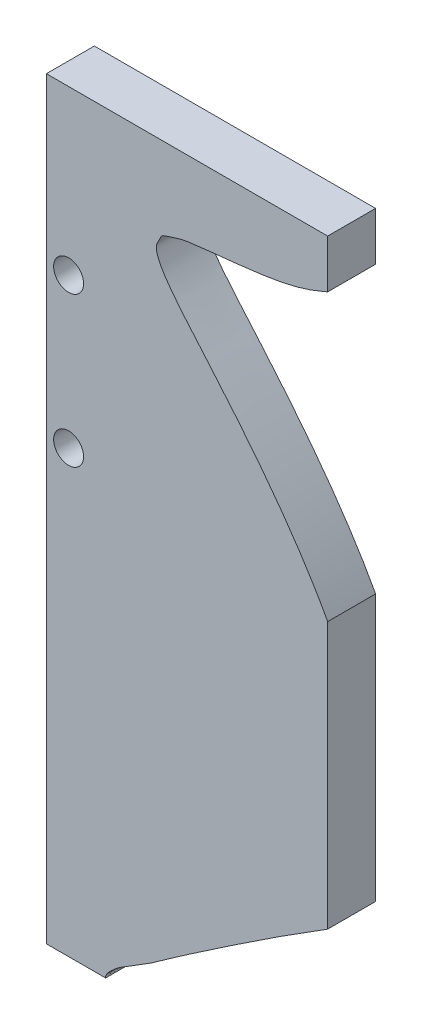
ISO-10303-21;
HEADER;
FILE_DESCRIPTION(('STEP AP214'),'2;1');
FILE_NAME('part.step','',(''),(''),'','','');
FILE_SCHEMA(('AUTOMOTIVE_DESIGN { 1 0 10303 214 1 1 1 1 }'));
ENDSEC;
DATA;
#1=APPLICATION_CONTEXT('core data for automotive mechanical design processes');
#2=APPLICATION_PROTOCOL_DEFINITION('international standard','automotive_design',2000,#1);
#3=PRODUCT_CONTEXT('',#1,'mechanical');
#4=PRODUCT('Part','Part','',(#3));
#5=PRODUCT_RELATED_PRODUCT_CATEGORY('part','',(#4));
#6=PRODUCT_DEFINITION_FORMATION('','',#4);
#7=PRODUCT_DEFINITION_CONTEXT('part definition',#1,'design');
#8=PRODUCT_DEFINITION('design','',#6,#7);
#9=PRODUCT_DEFINITION_SHAPE('','',#8);
#10=(LENGTH_UNIT() NAMED_UNIT(*) SI_UNIT(.MILLI.,.METRE.));
#11=(NAMED_UNIT(*) PLANE_ANGLE_UNIT() SI_UNIT($,.RADIAN.));
#12=(NAMED_UNIT(*) SI_UNIT($,.STERADIAN.) SOLID_ANGLE_UNIT());
#13=UNCERTAINTY_MEASURE_WITH_UNIT(LENGTH_MEASURE(1.E-05),#10,'distance_accuracy_value','');
#14=(GEOMETRIC_REPRESENTATION_CONTEXT(3) GLOBAL_UNCERTAINTY_ASSIGNED_CONTEXT((#13)) GLOBAL_UNIT_ASSIGNED_CONTEXT((#10,
#11,#12)) REPRESENTATION_CONTEXT('',''));
#15=CARTESIAN_POINT('',(0.,0.,0.));
#16=DIRECTION('',(0.,0.,1.));
#17=DIRECTION('',(1.,0.,0.));
#18=AXIS2_PLACEMENT_3D('',#15,#16,#17);
#19=CARTESIAN_POINT('',(-98.7597098849299,-123.501295729028,51.9999999999997));
#20=DIRECTION('',(0.,0.,-1.));
#21=DIRECTION('',(-1.,0.,0.));
#22=AXIS2_PLACEMENT_3D('',#19,#20,#21);
#23=PLANE('',#22);
#24=CARTESIAN_POINT('',(-100.,-50.,51.9999999999997));
#25=DIRECTION('',(0.,0.,-1.));
#26=DIRECTION('',(-1.,0.,0.));
#27=AXIS2_PLACEMENT_3D('',#24,#25,#26);
#28=CIRCLE('',#27,2.5);
#29=CARTESIAN_POINT('',(-102.5,-50.,51.9999999999997));
#30=VERTEX_POINT('',#29);
#31=EDGE_CURVE('E284',#30,#30,#28,.F.);
#32=ORIENTED_EDGE('',*,*,#31,.T.);
#33=EDGE_LOOP('',(#32));
#34=FACE_BOUND('',#33,.T.);
#35=CARTESIAN_POINT('',(-103.702711141899,-123.506773798911,51.9999999999997));
#36=CARTESIAN_POINT('',(-100.40737687753,-123.503208084161,51.9999999999997));
#37=CARTESIAN_POINT('',(-97.112042786673,-123.499476187349,51.9999999999997));
#38=CARTESIAN_POINT('',(-93.8167089449312,-123.495539218782,51.9999999999997));
#39=B_SPLINE_CURVE_WITH_KNOTS('',3,(#35,#36,#37,#38),.UNSPECIFIED.,.F.,.F.,(4,4),(0.,1.),.UNSPECIFIED.);
#40=CARTESIAN_POINT('',(-103.702711141899,-123.506773798911,51.9999999999997));
#41=VERTEX_POINT('',#40);
#42=CARTESIAN_POINT('',(-93.8167089449152,-123.495539218776,51.9999999999997));
#43=VERTEX_POINT('',#42);
#44=EDGE_CURVE('E272',#41,#43,#39,.T.);
#45=ORIENTED_EDGE('',*,*,#44,.F.);
#46=DIRECTION('',(2.22965543061431E-06,-0.999999999997514,0.));
#47=VECTOR('',#46,1.);
#48=CARTESIAN_POINT('',(-103.702991549551,2.25600000000001,51.9999999999997));
#49=LINE('',#48,#47);
#50=CARTESIAN_POINT('',(-103.702991549551,2.25600000000001,51.9999999999997));
#51=VERTEX_POINT('',#50);
#52=EDGE_CURVE('E115',#51,#41,#49,.T.);
#53=ORIENTED_EDGE('',*,*,#52,.F.);
#54=DIRECTION('',(-1.,0.,0.));
#55=VECTOR('',#54,1.);
#56=CARTESIAN_POINT('',(-56.7695236325579,2.25600000000002,51.9999999999997));
#57=LINE('',#56,#55);
#58=CARTESIAN_POINT('',(-56.7695236325579,2.25600000000002,51.9999999999997));
#59=VERTEX_POINT('',#58);
#60=EDGE_CURVE('E100',#59,#51,#57,.T.);
#61=ORIENTED_EDGE('',*,*,#60,.F.);
#62=DIRECTION('',(1.15147957942794E-06,0.999999999999337,0.));
#63=VECTOR('',#62,1.);
#64=CARTESIAN_POINT('',(-56.7695329293014,-5.81773721069318,51.9999999999997));
#65=LINE('',#64,#63);
#66=CARTESIAN_POINT('',(-56.7695329293014,-5.81773721069318,51.9999999999997));
#67=VERTEX_POINT('',#66);
#68=EDGE_CURVE('E113',#67,#59,#65,.T.);
#69=ORIENTED_EDGE('',*,*,#68,.F.);
#70=CARTESIAN_POINT('',(-56.7695329292906,-53.4654598959933,51.9999999999997));
#71=CARTESIAN_POINT('',(-58.3279176550688,-50.5652022090008,51.9999999999997));
#72=CARTESIAN_POINT('',(-60.0458163650792,-47.7755593209565,51.9999999999997));
#73=CARTESIAN_POINT('',(-63.6841224257361,-42.3367029415574,51.9999999999997));
#74=CARTESIAN_POINT('',(-65.6066400958873,-39.6889528489687,51.9999999999997));
#75=CARTESIAN_POINT('',(-69.59385911654,-34.4920497823535,51.9999999999997));
#76=CARTESIAN_POINT('',(-71.6612789031946,-31.9447819049219,51.9999999999997));
#77=CARTESIAN_POINT('',(-74.832218781466,-28.1722898948834,51.9999999999997));
#78=CARTESIAN_POINT('',(-75.9009650378508,-26.9237924939028,51.9999999999997));
#79=CARTESIAN_POINT('',(-78.0446799906788,-24.4323687938481,51.9999999999997));
#80=CARTESIAN_POINT('',(-79.1191986805002,-23.1888206374747,51.9999999999997));
#81=CARTESIAN_POINT('',(-80.7095480647281,-21.3060758861857,51.9999999999997));
#82=CARTESIAN_POINT('',(-81.2357519471803,-20.675313188786,51.9999999999997));
#83=CARTESIAN_POINT('',(-82.2666969838601,-19.3963375704427,51.9999999999997));
#84=CARTESIAN_POINT('',(-82.7720159458991,-18.7485944348576,51.9999999999997));
#85=CARTESIAN_POINT('',(-83.4946382290064,-17.748233484109,51.9999999999997));
#86=CARTESIAN_POINT('',(-83.7296249870898,-17.4099931481599,51.9999999999997));
#87=CARTESIAN_POINT('',(-84.1791355004317,-16.7168750772351,51.9999999999997));
#88=CARTESIAN_POINT('',(-84.3939779161146,-16.3606429659094,51.9999999999997));
#89=CARTESIAN_POINT('',(-84.7867311302017,-15.6307206780778,51.9999999999997));
#90=CARTESIAN_POINT('',(-84.967426152921,-15.2561058803352,51.9999999999997));
#91=CARTESIAN_POINT('',(-85.1824313439142,-14.6718481787901,51.9999999999997));
#92=CARTESIAN_POINT('',(-85.244415864692,-14.4743277477087,51.9999999999997));
#93=CARTESIAN_POINT('',(-85.3343984825506,-14.0695728213538,51.9999999999997));
#94=CARTESIAN_POINT('',(-85.3627801968095,-13.8612529253944,51.9999999999997));
#95=CARTESIAN_POINT('',(-85.35728705094,-13.5512409796281,51.9999999999997));
#96=CARTESIAN_POINT('',(-85.3467868153444,-13.4471122573843,51.9999999999997));
#97=CARTESIAN_POINT('',(-85.3048660143386,-13.2422802780594,51.9999999999997));
#98=CARTESIAN_POINT('',(-85.2744862286209,-13.1433287680236,51.9999999999997));
#99=CARTESIAN_POINT('',(-85.1609206691903,-12.8547226659315,51.9999999999997));
#100=CARTESIAN_POINT('',(-85.0545474148648,-12.6738347536151,51.9999999999997));
#101=CARTESIAN_POINT('',(-84.9008335415997,-12.4014077728929,51.9999999999997));
#102=CARTESIAN_POINT('',(-84.8514702210148,-12.3095500159792,51.9999999999997));
#103=CARTESIAN_POINT('',(-84.7619168644723,-12.1207025199345,51.9999999999997));
#104=CARTESIAN_POINT('',(-84.7203415074834,-12.0244877968622,51.9999999999997));
#105=CARTESIAN_POINT('',(-84.6351759235635,-11.8331855671003,51.9999999999997));
#106=CARTESIAN_POINT('',(-84.5913276664033,-11.7382424150885,51.9999999999997));
#107=CARTESIAN_POINT('',(-84.4944879794927,-11.6132082485187,51.9999999999997));
#108=CARTESIAN_POINT('',(-84.4565469902504,-11.5740494880328,51.9999999999997));
#109=CARTESIAN_POINT('',(-84.3696728070496,-11.5046442460547,51.9999999999997));
#110=CARTESIAN_POINT('',(-84.3239274088768,-11.4756748098542,51.9999999999997));
#111=CARTESIAN_POINT('',(-84.183097584497,-11.3976920678572,51.9999999999997));
#112=CARTESIAN_POINT('',(-84.0844654237031,-11.3574903377027,51.9999999999997));
#113=CARTESIAN_POINT('',(-83.8846339212681,-11.2834630331249,51.9999999999997));
#114=CARTESIAN_POINT('',(-83.7834629030526,-11.2495671112729,51.9999999999997));
#115=CARTESIAN_POINT('',(-83.4796043306875,-11.1487375146238,51.9999999999997));
#116=CARTESIAN_POINT('',(-83.276104119419,-11.0841640781263,51.9999999999997));
#117=CARTESIAN_POINT('',(-82.6689046056831,-10.8793703577853,51.9999999999997));
#118=CARTESIAN_POINT('',(-82.2650326458475,-10.7388650229722,51.9999999999997));
#119=CARTESIAN_POINT('',(-81.6525586150427,-10.5566778668308,51.9999999999997));
#120=CARTESIAN_POINT('',(-81.4474307404424,-10.5001056503762,51.9999999999997));
#121=CARTESIAN_POINT('',(-81.0341631036103,-10.3998701587435,51.9999999999997));
#122=CARTESIAN_POINT('',(-80.8260614593274,-10.3560435101518,51.9999999999997));
#123=CARTESIAN_POINT('',(-80.1986764905888,-10.2377645888818,51.9999999999997));
#124=CARTESIAN_POINT('',(-79.7763810701999,-10.1762221502602,51.9999999999997));
#125=CARTESIAN_POINT('',(-78.9289304674237,-10.0653942042904,51.9999999999997));
#126=CARTESIAN_POINT('',(-78.5038131779734,-10.0163576966844,51.9999999999997));
#127=CARTESIAN_POINT('',(-77.6536389897566,-9.92228714463002,51.9999999999997));
#128=CARTESIAN_POINT('',(-77.228400846825,-9.87664682598323,51.9999999999997));
#129=CARTESIAN_POINT('',(-75.9523833648475,-9.74252460931887,51.9999999999997));
#130=CARTESIAN_POINT('',(-75.1012329882266,-9.65746929611332,51.9999999999997));
#131=CARTESIAN_POINT('',(-73.3995605468317,-9.48155612037187,51.9999999999997));
#132=CARTESIAN_POINT('',(-72.5489717216659,-9.3913147995562,51.9999999999997));
#133=CARTESIAN_POINT('',(-69.9987844775912,-9.10600641015252,51.9999999999997));
#134=CARTESIAN_POINT('',(-68.3002255443565,-8.89841004305052,51.9999999999997));
#135=CARTESIAN_POINT('',(-64.9242226955031,-8.3690471351075,51.9999999999997));
#136=CARTESIAN_POINT('',(-63.2448751892393,-8.0439101595905,51.9999999999997));
#137=CARTESIAN_POINT('',(-60.7677656707657,-7.35307160278596,51.9999999999997));
#138=CARTESIAN_POINT('',(-59.9532827825983,-7.08913814652217,51.9999999999997));
#139=CARTESIAN_POINT('',(-58.7491763104807,-6.64039524209417,51.9999999999997));
#140=CARTESIAN_POINT('',(-58.3506113854006,-6.48195714311191,51.9999999999997));
#141=CARTESIAN_POINT('',(-57.5584304449573,-6.15377882682249,51.9999999999997));
#142=CARTESIAN_POINT('',(-57.1650211104286,-5.9832687590392,51.9999999999997));
#143=CARTESIAN_POINT('',(-56.7695329293014,-5.81773721069318,51.9999999999997));
#144=B_SPLINE_CURVE_WITH_KNOTS('',3,(#70,#71,#72,#73,#74,#75,#76,#77,#78,#79,#80,#81,#82,#83,
#84,#85,#86,#87,#88,#89,#90,#91,#92,#93,#94,#95,#96,#97,#98,#99,#100,#101,#102,#103,#104,#105,
#106,#107,#108,#109,#110,#111,#112,#113,#114,#115,#116,#117,#118,#119,#120,#121,#122,#123,#124,
#125,#126,#127,#128,#129,#130,#131,#132,#133,#134,#135,#136,#137,#138,#139,#140,#141,#142,#143),
.UNSPECIFIED.,.F.,.F.,(4,2,2,2,2,2,2,2,2,2,2,2,2,2,2,2,2,2,2,2,2,2,2,2,2,2,2,2,2,2,2,2,2,2,2,2,
4),(0.,0.125000000000002,0.250000000000005,0.375000000000007,0.437500000000008,
0.500000000000009,0.53125000000001,0.56250000000001,0.57812500000001,0.593750000000011,
0.609375000000011,0.617187500000011,0.625000000000011,0.628906250000011,0.632812500000011,
0.640625000000011,0.644531250000011,0.648437500000011,0.652343750000011,0.654296875000011,
0.656250000000011,0.660156250000011,0.664062500000011,0.67187500000001,0.687500000000008,
0.695312500000008,0.703125000000007,0.718750000000007,0.734375000000006,0.750000000000006,
0.781250000000005,0.812500000000005,0.875000000000003,0.937500000000002,0.968750000000001,
0.984375,1.),.UNSPECIFIED.);
#145=CARTESIAN_POINT('',(-56.7695329292906,-53.4654598959933,51.9999999999997));
#146=VERTEX_POINT('',#145);
#147=EDGE_CURVE('E118',#146,#67,#144,.T.);
#148=ORIENTED_EDGE('',*,*,#147,.F.);
#149=DIRECTION('',(0.,1.,0.));
#150=VECTOR('',#149,1.);
#151=CARTESIAN_POINT('',(-56.7695329292915,-97.9128350395995,51.9999999999997));
#152=LINE('',#151,#150);
#153=CARTESIAN_POINT('',(-56.7695329292914,-97.9128350395995,51.9999999999997));
#154=VERTEX_POINT('',#153);
#155=EDGE_CURVE('E120',#154,#146,#152,.T.);
#156=ORIENTED_EDGE('',*,*,#155,.F.);
#157=CARTESIAN_POINT('',(-93.8167089449152,-123.495539218776,51.9999999999997));
#158=CARTESIAN_POINT('',(-93.8332632211288,-123.438087057128,51.9999999999997));
#159=CARTESIAN_POINT('',(-93.8377855377238,-123.376921328402,51.9999999999997));
#160=CARTESIAN_POINT('',(-93.8264744043645,-123.257250053105,51.9999999999997));
#161=CARTESIAN_POINT('',(-93.8111824820266,-123.198717746609,51.9999999999997));
#162=CARTESIAN_POINT('',(-93.7494208552882,-123.030722987781,51.9999999999997));
#163=CARTESIAN_POINT('',(-93.6880201761431,-122.926477343674,51.9999999999997));
#164=CARTESIAN_POINT('',(-93.4917076185506,-122.631146194355,51.9999999999997));
#165=CARTESIAN_POINT('',(-93.3367062290319,-122.45240204143,51.9999999999997));
#166=CARTESIAN_POINT('',(-93.0169346069029,-122.102260012443,51.9999999999997));
#167=CARTESIAN_POINT('',(-92.8490183291129,-121.936248649227,51.9999999999997));
#168=CARTESIAN_POINT('',(-92.5043262248207,-121.616698720141,51.9999999999997));
#169=CARTESIAN_POINT('',(-92.3270343333934,-121.463248328617,51.9999999999997));
#170=CARTESIAN_POINT('',(-91.78016075561,-121.022075968886,51.9999999999997));
#171=CARTESIAN_POINT('',(-91.3967571797871,-120.752028968307,51.9999999999997));
#172=CARTESIAN_POINT('',(-90.6116915416809,-120.235283305875,51.9999999999997));
#173=CARTESIAN_POINT('',(-90.2099845582809,-119.988566214134,51.9999999999997));
#174=CARTESIAN_POINT('',(-89.4027489630587,-119.502696725017,51.9999999999997));
#175=CARTESIAN_POINT('',(-88.9969349738565,-119.263219717501,51.9999999999997));
#176=CARTESIAN_POINT('',(-88.1886080730294,-118.779068406266,51.9999999999997));
#177=CARTESIAN_POINT('',(-87.7862285450289,-118.534184100149,51.9999999999997));
#178=CARTESIAN_POINT('',(-86.9881197384622,-118.033945174712,51.9999999999997));
#179=CARTESIAN_POINT('',(-86.5924278775835,-117.778531644081,51.9999999999997));
#180=CARTESIAN_POINT('',(-85.8093757259242,-117.254587157789,51.9999999999997));
#181=CARTESIAN_POINT('',(-85.4217465728039,-116.986479505483,51.9999999999997));
#182=CARTESIAN_POINT('',(-84.2657837580843,-116.171254220926,51.9999999999997));
#183=CARTESIAN_POINT('',(-83.5040080518885,-115.614728123363,51.9999999999997));
#184=CARTESIAN_POINT('',(-81.9645899911725,-114.524680942651,51.9999999999997));
#185=CARTESIAN_POINT('',(-81.1890789259843,-113.987935924136,51.9999999999997));
#186=CARTESIAN_POINT('',(-78.8562693496024,-112.38665625597,51.9999999999997));
#187=CARTESIAN_POINT('',(-77.2923524735934,-111.331685118164,51.9999999999997));
#188=CARTESIAN_POINT('',(-74.1701981019018,-109.213607793966,51.9999999999997));
#189=CARTESIAN_POINT('',(-72.6089835905598,-108.154769729908,51.9999999999997));
#190=CARTESIAN_POINT('',(-69.4736178044836,-106.056246505514,51.9999999999997));
#191=CARTESIAN_POINT('',(-67.8995647929402,-105.016648161566,51.9999999999997));
#192=CARTESIAN_POINT('',(-63.1593861132054,-101.925188361279,51.9999999999997));
#193=CARTESIAN_POINT('',(-59.9778750567322,-99.8976159745702,51.9999999999997));
#194=CARTESIAN_POINT('',(-56.7695329292914,-97.9128350395995,51.9999999999997));
#195=B_SPLINE_CURVE_WITH_KNOTS('',3,(#157,#158,#159,#160,#161,#162,#163,#164,#165,#166,#167,
#168,#169,#170,#171,#172,#173,#174,#175,#176,#177,#178,#179,#180,#181,#182,#183,#184,#185,#186,
#187,#188,#189,#190,#191,#192,#193,#194),.UNSPECIFIED.,.F.,.F.,(4,2,2,2,2,2,2,2,2,2,2,2,2,2,2,2,
2,2,4),(0.,0.00390625000000042,0.00781250000000083,0.0156250000000008,0.0312500000000008,
0.0468750000000007,0.0625000000000007,0.0937500000000006,0.125,0.15625,0.1875,0.21875,0.25,
0.312500000000001,0.375000000000001,0.500000000000001,0.625000000000001,0.750000000000001,1.),.UNSPECIFIED.);
#196=EDGE_CURVE('E235',#43,#154,#195,.T.);
#197=ORIENTED_EDGE('',*,*,#196,.F.);
#198=EDGE_LOOP('',(#45,#53,#61,#69,#148,#156,#197));
#199=FACE_BOUND('',#198,.T.);
#200=CARTESIAN_POINT('',(-100.,-25.,51.9999999999997));
#201=DIRECTION('',(0.,0.,-1.));
#202=DIRECTION('',(-1.,0.,0.));
#203=AXIS2_PLACEMENT_3D('',#200,#201,#202);
#204=CIRCLE('',#203,2.5);
#205=CARTESIAN_POINT('',(-102.5,-25.,51.9999999999997));
#206=VERTEX_POINT('',#205);
#207=EDGE_CURVE('E285',#206,#206,#204,.F.);
#208=ORIENTED_EDGE('',*,*,#207,.T.);
#209=EDGE_LOOP('',(#208));
#210=FACE_BOUND('',#209,.T.);
#211=ADVANCED_FACE('F30',(#34,#199,#210),#23,.T.);
#212=CARTESIAN_POINT('',(-98.7597098849299,-123.501295729028,59.9999999999997));
#213=DIRECTION('',(0.,0.,-1.));
#214=DIRECTION('',(-1.,0.,0.));
#215=AXIS2_PLACEMENT_3D('',#212,#213,#214);
#216=PLANE('',#215);
#217=CARTESIAN_POINT('',(-100.,-50.,59.9999999999997));
#218=DIRECTION('',(0.,0.,-1.));
#219=DIRECTION('',(-1.,0.,0.));
#220=AXIS2_PLACEMENT_3D('',#217,#218,#219);
#221=CIRCLE('',#220,2.5);
#222=CARTESIAN_POINT('',(-102.5,-50.,59.9999999999997));
#223=VERTEX_POINT('',#222);
#224=EDGE_CURVE('E282',#223,#223,#221,.F.);
#225=ORIENTED_EDGE('',*,*,#224,.F.);
#226=EDGE_LOOP('',(#225));
#227=FACE_BOUND('',#226,.T.);
#228=CARTESIAN_POINT('',(-93.8167089449312,-123.495539218782,59.9999999999997));
#229=CARTESIAN_POINT('',(-97.112042786673,-123.499476187349,59.9999999999997));
#230=CARTESIAN_POINT('',(-100.40737687753,-123.503208084161,59.9999999999997));
#231=CARTESIAN_POINT('',(-103.702711141899,-123.506773798911,59.9999999999997));
#232=B_SPLINE_CURVE_WITH_KNOTS('',3,(#228,#229,#230,#231),.UNSPECIFIED.,.F.,.F.,(4,4),(0.,1.),.UNSPECIFIED.);
#233=CARTESIAN_POINT('',(-103.702711141899,-123.506773798911,59.9999999999997));
#234=VERTEX_POINT('',#233);
#235=CARTESIAN_POINT('',(-93.8167089449152,-123.495539218776,59.9999999999997));
#236=VERTEX_POINT('',#235);
#237=EDGE_CURVE('E289',#234,#236,#232,.F.);
#238=ORIENTED_EDGE('',*,*,#237,.T.);
#239=CARTESIAN_POINT('',(-56.7695329292914,-97.9128350395995,59.9999999999997));
#240=CARTESIAN_POINT('',(-59.9778750567322,-99.8976159745702,59.9999999999997));
#241=CARTESIAN_POINT('',(-63.1593861132054,-101.925188361279,59.9999999999997));
#242=CARTESIAN_POINT('',(-67.8995647929402,-105.016648161566,59.9999999999997));
#243=CARTESIAN_POINT('',(-69.4736178044836,-106.056246505514,59.9999999999997));
#244=CARTESIAN_POINT('',(-72.6089835905598,-108.154769729908,59.9999999999997));
#245=CARTESIAN_POINT('',(-74.1701981019018,-109.213607793966,59.9999999999997));
#246=CARTESIAN_POINT('',(-77.2923524735934,-111.331685118164,59.9999999999997));
#247=CARTESIAN_POINT('',(-78.8562693496024,-112.38665625597,59.9999999999997));
#248=CARTESIAN_POINT('',(-81.1890789259843,-113.987935924136,59.9999999999997));
#249=CARTESIAN_POINT('',(-81.9645899911725,-114.524680942651,59.9999999999997));
#250=CARTESIAN_POINT('',(-83.5040080518885,-115.614728123363,59.9999999999997));
#251=CARTESIAN_POINT('',(-84.2657837580843,-116.171254220926,59.9999999999997));
#252=CARTESIAN_POINT('',(-85.4217465728039,-116.986479505483,59.9999999999997));
#253=CARTESIAN_POINT('',(-85.8093757259242,-117.254587157789,59.9999999999997));
#254=CARTESIAN_POINT('',(-86.5924278775835,-117.778531644081,59.9999999999997));
#255=CARTESIAN_POINT('',(-86.9881197384622,-118.033945174712,59.9999999999997));
#256=CARTESIAN_POINT('',(-87.7862285450289,-118.534184100149,59.9999999999997));
#257=CARTESIAN_POINT('',(-88.1886080730294,-118.779068406266,59.9999999999997));
#258=CARTESIAN_POINT('',(-88.9969349738565,-119.263219717501,59.9999999999997));
#259=CARTESIAN_POINT('',(-89.4027489630587,-119.502696725017,59.9999999999997));
#260=CARTESIAN_POINT('',(-90.2099845582809,-119.988566214134,59.9999999999997));
#261=CARTESIAN_POINT('',(-90.6116915416809,-120.235283305875,59.9999999999997));
#262=CARTESIAN_POINT('',(-91.3967571797871,-120.752028968307,59.9999999999997));
#263=CARTESIAN_POINT('',(-91.78016075561,-121.022075968886,59.9999999999997));
#264=CARTESIAN_POINT('',(-92.3270343333934,-121.463248328617,59.9999999999997));
#265=CARTESIAN_POINT('',(-92.5043262248207,-121.616698720141,59.9999999999997));
#266=CARTESIAN_POINT('',(-92.8490183291129,-121.936248649227,59.9999999999997));
#267=CARTESIAN_POINT('',(-93.0169346069029,-122.102260012443,59.9999999999997));
#268=CARTESIAN_POINT('',(-93.3367062290319,-122.45240204143,59.9999999999997));
#269=CARTESIAN_POINT('',(-93.4917076185506,-122.631146194355,59.9999999999997));
#270=CARTESIAN_POINT('',(-93.6880201761431,-122.926477343674,59.9999999999997));
#271=CARTESIAN_POINT('',(-93.7494208552882,-123.030722987781,59.9999999999997));
#272=CARTESIAN_POINT('',(-93.8111824820266,-123.198717746609,59.9999999999997));
#273=CARTESIAN_POINT('',(-93.8264744043645,-123.257250053105,59.9999999999997));
#274=CARTESIAN_POINT('',(-93.8377855377238,-123.376921328402,59.9999999999997));
#275=CARTESIAN_POINT('',(-93.8332632211288,-123.438087057128,59.9999999999997));
#276=CARTESIAN_POINT('',(-93.8167089449152,-123.495539218776,59.9999999999997));
#277=B_SPLINE_CURVE_WITH_KNOTS('',3,(#239,#240,#241,#242,#243,#244,#245,#246,#247,#248,#249,
#250,#251,#252,#253,#254,#255,#256,#257,#258,#259,#260,#261,#262,#263,#264,#265,#266,#267,#268,
#269,#270,#271,#272,#273,#274,#275,#276),.UNSPECIFIED.,.F.,.F.,(4,2,2,2,2,2,2,2,2,2,2,2,2,2,2,2,
2,2,4),(0.,0.249999999999999,0.374999999999999,0.499999999999999,0.624999999999999,
0.687499999999999,0.75,0.78125,0.8125,0.84375,0.875,0.906249999999999,0.937499999999999,
0.953124999999999,0.968749999999999,0.984374999999999,0.992187499999999,0.99609375,1.),.UNSPECIFIED.);
#278=CARTESIAN_POINT('',(-56.7695329292914,-97.9128350395995,59.9999999999997));
#279=VERTEX_POINT('',#278);
#280=EDGE_CURVE('E169',#236,#279,#277,.F.);
#281=ORIENTED_EDGE('',*,*,#280,.T.);
#282=DIRECTION('',(0.,1.,0.));
#283=VECTOR('',#282,1.);
#284=CARTESIAN_POINT('',(-56.7695329292915,-97.9128350395995,59.9999999999997));
#285=LINE('',#284,#283);
#286=CARTESIAN_POINT('',(-56.7695329292906,-53.4654598959933,59.9999999999997));
#287=VERTEX_POINT('',#286);
#288=EDGE_CURVE('E222',#279,#287,#285,.T.);
#289=ORIENTED_EDGE('',*,*,#288,.T.);
#290=CARTESIAN_POINT('',(-56.7695329293014,-5.81773721069318,59.9999999999997));
#291=CARTESIAN_POINT('',(-57.1650211104286,-5.9832687590392,59.9999999999997));
#292=CARTESIAN_POINT('',(-57.5584304449573,-6.15377882682249,59.9999999999997));
#293=CARTESIAN_POINT('',(-58.3506113854006,-6.48195714311191,59.9999999999997));
#294=CARTESIAN_POINT('',(-58.7491763104807,-6.64039524209417,59.9999999999997));
#295=CARTESIAN_POINT('',(-59.9532827825983,-7.08913814652217,59.9999999999997));
#296=CARTESIAN_POINT('',(-60.7677656707657,-7.35307160278596,59.9999999999997));
#297=CARTESIAN_POINT('',(-63.2448751892393,-8.0439101595905,59.9999999999997));
#298=CARTESIAN_POINT('',(-64.9242226955031,-8.3690471351075,59.9999999999997));
#299=CARTESIAN_POINT('',(-68.3002255443565,-8.89841004305052,59.9999999999997));
#300=CARTESIAN_POINT('',(-69.9987844775912,-9.10600641015252,59.9999999999997));
#301=CARTESIAN_POINT('',(-72.5489717216659,-9.3913147995562,59.9999999999997));
#302=CARTESIAN_POINT('',(-73.3995605468317,-9.48155612037187,59.9999999999997));
#303=CARTESIAN_POINT('',(-75.1012329882266,-9.65746929611332,59.9999999999997));
#304=CARTESIAN_POINT('',(-75.9523833648475,-9.74252460931887,59.9999999999997));
#305=CARTESIAN_POINT('',(-77.228400846825,-9.87664682598323,59.9999999999997));
#306=CARTESIAN_POINT('',(-77.6536389897566,-9.92228714463002,59.9999999999997));
#307=CARTESIAN_POINT('',(-78.5038131779734,-10.0163576966844,59.9999999999997));
#308=CARTESIAN_POINT('',(-78.9289304674237,-10.0653942042904,59.9999999999997));
#309=CARTESIAN_POINT('',(-79.7763810701999,-10.1762221502602,59.9999999999997));
#310=CARTESIAN_POINT('',(-80.1986764905888,-10.2377645888818,59.9999999999997));
#311=CARTESIAN_POINT('',(-80.8260614593274,-10.3560435101518,59.9999999999997));
#312=CARTESIAN_POINT('',(-81.0341631036103,-10.3998701587435,59.9999999999997));
#313=CARTESIAN_POINT('',(-81.4474307404424,-10.5001056503762,59.9999999999997));
#314=CARTESIAN_POINT('',(-81.6525586150427,-10.5566778668308,59.9999999999997));
#315=CARTESIAN_POINT('',(-82.2650326458475,-10.7388650229722,59.9999999999997));
#316=CARTESIAN_POINT('',(-82.6689046056831,-10.8793703577853,59.9999999999997));
#317=CARTESIAN_POINT('',(-83.276104119419,-11.0841640781263,59.9999999999997));
#318=CARTESIAN_POINT('',(-83.4796043306875,-11.1487375146238,59.9999999999997));
#319=CARTESIAN_POINT('',(-83.7834629030526,-11.2495671112729,59.9999999999997));
#320=CARTESIAN_POINT('',(-83.8846339212681,-11.2834630331249,59.9999999999997));
#321=CARTESIAN_POINT('',(-84.0844654237031,-11.3574903377027,59.9999999999997));
#322=CARTESIAN_POINT('',(-84.183097584497,-11.3976920678572,59.9999999999997));
#323=CARTESIAN_POINT('',(-84.3239274088768,-11.4756748098542,59.9999999999997));
#324=CARTESIAN_POINT('',(-84.3696728070496,-11.5046442460547,59.9999999999997));
#325=CARTESIAN_POINT('',(-84.4565469902504,-11.5740494880328,59.9999999999997));
#326=CARTESIAN_POINT('',(-84.4944879794927,-11.6132082485187,59.9999999999997));
#327=CARTESIAN_POINT('',(-84.5913276664033,-11.7382424150885,59.9999999999997));
#328=CARTESIAN_POINT('',(-84.6351759235635,-11.8331855671003,59.9999999999997));
#329=CARTESIAN_POINT('',(-84.7203415074834,-12.0244877968622,59.9999999999997));
#330=CARTESIAN_POINT('',(-84.7619168644723,-12.1207025199345,59.9999999999997));
#331=CARTESIAN_POINT('',(-84.8514702210148,-12.3095500159792,59.9999999999997));
#332=CARTESIAN_POINT('',(-84.9008335415997,-12.4014077728929,59.9999999999997));
#333=CARTESIAN_POINT('',(-85.0545474148648,-12.6738347536151,59.9999999999997));
#334=CARTESIAN_POINT('',(-85.1609206691903,-12.8547226659315,59.9999999999997));
#335=CARTESIAN_POINT('',(-85.2744862286209,-13.1433287680236,59.9999999999997));
#336=CARTESIAN_POINT('',(-85.3048660143386,-13.2422802780594,59.9999999999997));
#337=CARTESIAN_POINT('',(-85.3467868153444,-13.4471122573843,59.9999999999997));
#338=CARTESIAN_POINT('',(-85.35728705094,-13.5512409796281,59.9999999999997));
#339=CARTESIAN_POINT('',(-85.3627801968095,-13.8612529253944,59.9999999999997));
#340=CARTESIAN_POINT('',(-85.3343984825506,-14.0695728213538,59.9999999999997));
#341=CARTESIAN_POINT('',(-85.244415864692,-14.4743277477087,59.9999999999997));
#342=CARTESIAN_POINT('',(-85.1824313439142,-14.6718481787901,59.9999999999997));
#343=CARTESIAN_POINT('',(-84.967426152921,-15.2561058803352,59.9999999999997));
#344=CARTESIAN_POINT('',(-84.7867311302017,-15.6307206780778,59.9999999999997));
#345=CARTESIAN_POINT('',(-84.3939779161146,-16.3606429659094,59.9999999999997));
#346=CARTESIAN_POINT('',(-84.1791355004317,-16.7168750772351,59.9999999999997));
#347=CARTESIAN_POINT('',(-83.7296249870898,-17.4099931481599,59.9999999999997));
#348=CARTESIAN_POINT('',(-83.4946382290064,-17.748233484109,59.9999999999997));
#349=CARTESIAN_POINT('',(-82.7720159458991,-18.7485944348576,59.9999999999997));
#350=CARTESIAN_POINT('',(-82.2666969838601,-19.3963375704427,59.9999999999997));
#351=CARTESIAN_POINT('',(-81.2357519471803,-20.675313188786,59.9999999999997));
#352=CARTESIAN_POINT('',(-80.7095480647281,-21.3060758861857,59.9999999999997));
#353=CARTESIAN_POINT('',(-79.1191986805002,-23.1888206374747,59.9999999999997));
#354=CARTESIAN_POINT('',(-78.0446799906788,-24.4323687938481,59.9999999999997));
#355=CARTESIAN_POINT('',(-75.9009650378508,-26.9237924939028,59.9999999999997));
#356=CARTESIAN_POINT('',(-74.832218781466,-28.1722898948834,59.9999999999997));
#357=CARTESIAN_POINT('',(-71.6612789031946,-31.9447819049219,59.9999999999997));
#358=CARTESIAN_POINT('',(-69.59385911654,-34.4920497823535,59.9999999999997));
#359=CARTESIAN_POINT('',(-65.6066400958873,-39.6889528489687,59.9999999999997));
#360=CARTESIAN_POINT('',(-63.6841224257361,-42.3367029415574,59.9999999999997));
#361=CARTESIAN_POINT('',(-60.0458163650792,-47.7755593209565,59.9999999999997));
#362=CARTESIAN_POINT('',(-58.3279176550688,-50.5652022090008,59.9999999999997));
#363=CARTESIAN_POINT('',(-56.7695329292906,-53.4654598959933,59.9999999999997));
#364=B_SPLINE_CURVE_WITH_KNOTS('',3,(#290,#291,#292,#293,#294,#295,#296,#297,#298,#299,#300,
#301,#302,#303,#304,#305,#306,#307,#308,#309,#310,#311,#312,#313,#314,#315,#316,#317,#318,#319,
#320,#321,#322,#323,#324,#325,#326,#327,#328,#329,#330,#331,#332,#333,#334,#335,#336,#337,#338,
#339,#340,#341,#342,#343,#344,#345,#346,#347,#348,#349,#350,#351,#352,#353,#354,#355,#356,#357,
#358,#359,#360,#361,#362,#363),.UNSPECIFIED.,.F.,.F.,(4,2,2,2,2,2,2,2,2,2,2,2,2,2,2,2,2,2,2,2,2,
2,2,2,2,2,2,2,2,2,2,2,2,2,2,2,4),(0.,0.0156249999999997,0.0312499999999992,0.0624999999999983,
0.124999999999997,0.187499999999995,0.218749999999995,0.249999999999994,0.265624999999994,
0.281249999999993,0.296874999999993,0.304687499999992,0.312499999999992,0.32812499999999,
0.335937499999989,0.339843749999989,0.343749999999989,0.345703124999989,0.347656249999989,
0.351562499999989,0.355468749999989,0.359374999999989,0.367187499999989,0.371093749999989,
0.374999999999989,0.382812499999989,0.390624999999989,0.406249999999989,0.42187499999999,
0.43749999999999,0.46874999999999,0.499999999999991,0.562499999999992,0.624999999999993,
0.749999999999995,0.874999999999998,1.),.UNSPECIFIED.);
#365=CARTESIAN_POINT('',(-56.7695329293014,-5.81773721069318,59.9999999999997));
#366=VERTEX_POINT('',#365);
#367=EDGE_CURVE('E132',#287,#366,#364,.F.);
#368=ORIENTED_EDGE('',*,*,#367,.T.);
#369=DIRECTION('',(1.15147957942794E-06,0.999999999999337,0.));
#370=VECTOR('',#369,1.);
#371=CARTESIAN_POINT('',(-56.7695329293014,-5.81773721069318,59.9999999999997));
#372=LINE('',#371,#370);
#373=CARTESIAN_POINT('',(-56.7695236325579,2.25600000000002,59.9999999999997));
#374=VERTEX_POINT('',#373);
#375=EDGE_CURVE('E231',#366,#374,#372,.T.);
#376=ORIENTED_EDGE('',*,*,#375,.T.);
#377=DIRECTION('',(-1.,0.,0.));
#378=VECTOR('',#377,1.);
#379=CARTESIAN_POINT('',(-56.7695236325579,2.25600000000002,59.9999999999997));
#380=LINE('',#379,#378);
#381=CARTESIAN_POINT('',(-103.702991549551,2.25600000000001,59.9999999999997));
#382=VERTEX_POINT('',#381);
#383=EDGE_CURVE('E102',#374,#382,#380,.T.);
#384=ORIENTED_EDGE('',*,*,#383,.T.);
#385=DIRECTION('',(2.22965543061431E-06,-0.999999999997514,0.));
#386=VECTOR('',#385,1.);
#387=CARTESIAN_POINT('',(-103.702991549551,2.25600000000001,59.9999999999997));
#388=LINE('',#387,#386);
#389=EDGE_CURVE('E273',#382,#234,#388,.T.);
#390=ORIENTED_EDGE('',*,*,#389,.T.);
#391=EDGE_LOOP('',(#238,#281,#289,#368,#376,#384,#390));
#392=FACE_BOUND('',#391,.T.);
#393=CARTESIAN_POINT('',(-100.,-25.,59.9999999999997));
#394=DIRECTION('',(0.,0.,-1.));
#395=DIRECTION('',(-1.,0.,0.));
#396=AXIS2_PLACEMENT_3D('',#393,#394,#395);
#397=CIRCLE('',#396,2.5);
#398=CARTESIAN_POINT('',(-102.5,-25.,59.9999999999997));
#399=VERTEX_POINT('',#398);
#400=EDGE_CURVE('E36',#399,#399,#397,.F.);
#401=ORIENTED_EDGE('',*,*,#400,.F.);
#402=EDGE_LOOP('',(#401));
#403=FACE_BOUND('',#402,.T.);
#404=ADVANCED_FACE('F138',(#227,#392,#403),#216,.F.);
#405=CARTESIAN_POINT('',(-103.702711141899,-123.506773798911,51.9999999999997));
#406=CARTESIAN_POINT('',(-100.40737687753,-123.503208084161,51.9999999999997));
#407=CARTESIAN_POINT('',(-97.112042786673,-123.499476187349,51.9999999999997));
#408=CARTESIAN_POINT('',(-93.8167089449312,-123.495539218782,51.9999999999997));
#409=B_SPLINE_CURVE_WITH_KNOTS('',3,(#405,#406,#407,#408),.UNSPECIFIED.,.F.,.F.,(4,4),(0.,1.),.UNSPECIFIED.);
#410=DIRECTION('',(0.,0.,1.));
#411=VECTOR('',#410,1.);
#412=SURFACE_OF_LINEAR_EXTRUSION('',#409,#411);
#413=ORIENTED_EDGE('',*,*,#237,.F.);
#414=DIRECTION('',(0.,0.,1.));
#415=VECTOR('',#414,1.);
#416=CARTESIAN_POINT('',(-103.702711141899,-123.506773798911,51.9999999999997));
#417=LINE('',#416,#415);
#418=EDGE_CURVE('E11',#41,#234,#417,.T.);
#419=ORIENTED_EDGE('',*,*,#418,.F.);
#420=ORIENTED_EDGE('',*,*,#44,.T.);
#421=DIRECTION('',(0.,0.,1.));
#422=VECTOR('',#421,1.);
#423=CARTESIAN_POINT('',(-93.8167089449152,-123.495539218776,51.9999999999997));
#424=LINE('',#423,#422);
#425=EDGE_CURVE('E86',#43,#236,#424,.T.);
#426=ORIENTED_EDGE('',*,*,#425,.T.);
#427=EDGE_LOOP('',(#413,#419,#420,#426));
#428=FACE_BOUND('',#427,.T.);
#429=ADVANCED_FACE('F32',(#428),#412,.T.);
#430=CARTESIAN_POINT('',(-103.702991549551,2.25600000000001,51.9999999999997));
#431=DIRECTION('',(-0.999999999997514,-2.22965543061431E-06,0.));
#432=DIRECTION('',(2.22965543061431E-06,-0.999999999997514,0.));
#433=AXIS2_PLACEMENT_3D('',#430,#431,#432);
#434=PLANE('',#433);
#435=ORIENTED_EDGE('',*,*,#389,.F.);
#436=DIRECTION('',(0.,0.,1.));
#437=VECTOR('',#436,1.);
#438=CARTESIAN_POINT('',(-103.702991549551,2.25600000000001,51.9999999999997));
#439=LINE('',#438,#437);
#440=EDGE_CURVE('E42',#51,#382,#439,.T.);
#441=ORIENTED_EDGE('',*,*,#440,.F.);
#442=ORIENTED_EDGE('',*,*,#52,.T.);
#443=ORIENTED_EDGE('',*,*,#418,.T.);
#444=EDGE_LOOP('',(#435,#441,#442,#443));
#445=FACE_BOUND('',#444,.T.);
#446=ADVANCED_FACE('F151',(#445),#434,.T.);
#447=CARTESIAN_POINT('',(-56.7695236325579,2.25600000000002,51.9999999999997));
#448=DIRECTION('',(0.,1.,0.));
#449=DIRECTION('',(-1.,0.,0.));
#450=AXIS2_PLACEMENT_3D('',#447,#448,#449);
#451=PLANE('',#450);
#452=ORIENTED_EDGE('',*,*,#383,.F.);
#453=DIRECTION('',(0.,0.,1.));
#454=VECTOR('',#453,1.);
#455=CARTESIAN_POINT('',(-56.7695236325579,2.25600000000002,51.9999999999997));
#456=LINE('',#455,#454);
#457=EDGE_CURVE('E97',#59,#374,#456,.T.);
#458=ORIENTED_EDGE('',*,*,#457,.F.);
#459=ORIENTED_EDGE('',*,*,#60,.T.);
#460=ORIENTED_EDGE('',*,*,#440,.T.);
#461=EDGE_LOOP('',(#452,#458,#459,#460));
#462=FACE_BOUND('',#461,.T.);
#463=ADVANCED_FACE('F99',(#462),#451,.T.);
#464=CARTESIAN_POINT('',(-56.7695329293014,-5.81773721069318,51.9999999999997));
#465=DIRECTION('',(0.999999999999337,-1.15147957942794E-06,0.));
#466=DIRECTION('',(1.15147957942794E-06,0.999999999999337,0.));
#467=AXIS2_PLACEMENT_3D('',#464,#465,#466);
#468=PLANE('',#467);
#469=ORIENTED_EDGE('',*,*,#375,.F.);
#470=DIRECTION('',(0.,0.,1.));
#471=VECTOR('',#470,1.);
#472=CARTESIAN_POINT('',(-56.7695329293014,-5.81773721069318,51.9999999999997));
#473=LINE('',#472,#471);
#474=EDGE_CURVE('E107',#67,#366,#473,.T.);
#475=ORIENTED_EDGE('',*,*,#474,.F.);
#476=ORIENTED_EDGE('',*,*,#68,.T.);
#477=ORIENTED_EDGE('',*,*,#457,.T.);
#478=EDGE_LOOP('',(#469,#475,#476,#477));
#479=FACE_BOUND('',#478,.T.);
#480=ADVANCED_FACE('F117',(#479),#468,.T.);
#481=CARTESIAN_POINT('',(-56.7695329292906,-53.4654598959933,51.9999999999997));
#482=CARTESIAN_POINT('',(-58.3279176550688,-50.5652022090008,51.9999999999997));
#483=CARTESIAN_POINT('',(-60.0458163650792,-47.7755593209565,51.9999999999997));
#484=CARTESIAN_POINT('',(-63.6841224257361,-42.3367029415574,51.9999999999997));
#485=CARTESIAN_POINT('',(-65.6066400958873,-39.6889528489687,51.9999999999997));
#486=CARTESIAN_POINT('',(-69.59385911654,-34.4920497823535,51.9999999999997));
#487=CARTESIAN_POINT('',(-71.6612789031946,-31.9447819049219,51.9999999999997));
#488=CARTESIAN_POINT('',(-74.832218781466,-28.1722898948834,51.9999999999997));
#489=CARTESIAN_POINT('',(-75.9009650378508,-26.9237924939028,51.9999999999997));
#490=CARTESIAN_POINT('',(-78.0446799906788,-24.4323687938481,51.9999999999997));
#491=CARTESIAN_POINT('',(-79.1191986805002,-23.1888206374747,51.9999999999997));
#492=CARTESIAN_POINT('',(-80.7095480647281,-21.3060758861857,51.9999999999997));
#493=CARTESIAN_POINT('',(-81.2357519471803,-20.675313188786,51.9999999999997));
#494=CARTESIAN_POINT('',(-82.2666969838601,-19.3963375704427,51.9999999999997));
#495=CARTESIAN_POINT('',(-82.7720159458991,-18.7485944348576,51.9999999999997));
#496=CARTESIAN_POINT('',(-83.4946382290064,-17.748233484109,51.9999999999997));
#497=CARTESIAN_POINT('',(-83.7296249870898,-17.4099931481599,51.9999999999997));
#498=CARTESIAN_POINT('',(-84.1791355004317,-16.7168750772351,51.9999999999997));
#499=CARTESIAN_POINT('',(-84.3939779161146,-16.3606429659094,51.9999999999997));
#500=CARTESIAN_POINT('',(-84.7867311302017,-15.6307206780778,51.9999999999997));
#501=CARTESIAN_POINT('',(-84.967426152921,-15.2561058803352,51.9999999999997));
#502=CARTESIAN_POINT('',(-85.1824313439142,-14.6718481787901,51.9999999999997));
#503=CARTESIAN_POINT('',(-85.244415864692,-14.4743277477087,51.9999999999997));
#504=CARTESIAN_POINT('',(-85.3343984825506,-14.0695728213538,51.9999999999997));
#505=CARTESIAN_POINT('',(-85.3627801968095,-13.8612529253944,51.9999999999997));
#506=CARTESIAN_POINT('',(-85.35728705094,-13.5512409796281,51.9999999999997));
#507=CARTESIAN_POINT('',(-85.3467868153444,-13.4471122573843,51.9999999999997));
#508=CARTESIAN_POINT('',(-85.3048660143386,-13.2422802780594,51.9999999999997));
#509=CARTESIAN_POINT('',(-85.2744862286209,-13.1433287680236,51.9999999999997));
#510=CARTESIAN_POINT('',(-85.1609206691903,-12.8547226659315,51.9999999999997));
#511=CARTESIAN_POINT('',(-85.0545474148648,-12.6738347536151,51.9999999999997));
#512=CARTESIAN_POINT('',(-84.9008335415997,-12.4014077728929,51.9999999999997));
#513=CARTESIAN_POINT('',(-84.8514702210148,-12.3095500159792,51.9999999999997));
#514=CARTESIAN_POINT('',(-84.7619168644723,-12.1207025199345,51.9999999999997));
#515=CARTESIAN_POINT('',(-84.7203415074834,-12.0244877968622,51.9999999999997));
#516=CARTESIAN_POINT('',(-84.6351759235635,-11.8331855671003,51.9999999999997));
#517=CARTESIAN_POINT('',(-84.5913276664033,-11.7382424150885,51.9999999999997));
#518=CARTESIAN_POINT('',(-84.4944879794927,-11.6132082485187,51.9999999999997));
#519=CARTESIAN_POINT('',(-84.4565469902504,-11.5740494880328,51.9999999999997));
#520=CARTESIAN_POINT('',(-84.3696728070496,-11.5046442460547,51.9999999999997));
#521=CARTESIAN_POINT('',(-84.3239274088768,-11.4756748098542,51.9999999999997));
#522=CARTESIAN_POINT('',(-84.183097584497,-11.3976920678572,51.9999999999997));
#523=CARTESIAN_POINT('',(-84.0844654237031,-11.3574903377027,51.9999999999997));
#524=CARTESIAN_POINT('',(-83.8846339212681,-11.2834630331249,51.9999999999997));
#525=CARTESIAN_POINT('',(-83.7834629030526,-11.2495671112729,51.9999999999997));
#526=CARTESIAN_POINT('',(-83.4796043306875,-11.1487375146238,51.9999999999997));
#527=CARTESIAN_POINT('',(-83.276104119419,-11.0841640781263,51.9999999999997));
#528=CARTESIAN_POINT('',(-82.6689046056831,-10.8793703577853,51.9999999999997));
#529=CARTESIAN_POINT('',(-82.2650326458475,-10.7388650229722,51.9999999999997));
#530=CARTESIAN_POINT('',(-81.6525586150427,-10.5566778668308,51.9999999999997));
#531=CARTESIAN_POINT('',(-81.4474307404424,-10.5001056503762,51.9999999999997));
#532=CARTESIAN_POINT('',(-81.0341631036103,-10.3998701587435,51.9999999999997));
#533=CARTESIAN_POINT('',(-80.8260614593274,-10.3560435101518,51.9999999999997));
#534=CARTESIAN_POINT('',(-80.1986764905888,-10.2377645888818,51.9999999999997));
#535=CARTESIAN_POINT('',(-79.7763810701999,-10.1762221502602,51.9999999999997));
#536=CARTESIAN_POINT('',(-78.9289304674237,-10.0653942042904,51.9999999999997));
#537=CARTESIAN_POINT('',(-78.5038131779734,-10.0163576966844,51.9999999999997));
#538=CARTESIAN_POINT('',(-77.6536389897566,-9.92228714463002,51.9999999999997));
#539=CARTESIAN_POINT('',(-77.228400846825,-9.87664682598323,51.9999999999997));
#540=CARTESIAN_POINT('',(-75.9523833648475,-9.74252460931887,51.9999999999997));
#541=CARTESIAN_POINT('',(-75.1012329882266,-9.65746929611332,51.9999999999997));
#542=CARTESIAN_POINT('',(-73.3995605468317,-9.48155612037187,51.9999999999997));
#543=CARTESIAN_POINT('',(-72.5489717216659,-9.3913147995562,51.9999999999997));
#544=CARTESIAN_POINT('',(-69.9987844775912,-9.10600641015252,51.9999999999997));
#545=CARTESIAN_POINT('',(-68.3002255443565,-8.89841004305052,51.9999999999997));
#546=CARTESIAN_POINT('',(-64.9242226955031,-8.3690471351075,51.9999999999997));
#547=CARTESIAN_POINT('',(-63.2448751892393,-8.0439101595905,51.9999999999997));
#548=CARTESIAN_POINT('',(-60.7677656707657,-7.35307160278596,51.9999999999997));
#549=CARTESIAN_POINT('',(-59.9532827825983,-7.08913814652217,51.9999999999997));
#550=CARTESIAN_POINT('',(-58.7491763104807,-6.64039524209417,51.9999999999997));
#551=CARTESIAN_POINT('',(-58.3506113854006,-6.48195714311191,51.9999999999997));
#552=CARTESIAN_POINT('',(-57.5584304449573,-6.15377882682249,51.9999999999997));
#553=CARTESIAN_POINT('',(-57.1650211104286,-5.9832687590392,51.9999999999997));
#554=CARTESIAN_POINT('',(-56.7695329293014,-5.81773721069318,51.9999999999997));
#555=B_SPLINE_CURVE_WITH_KNOTS('',3,(#481,#482,#483,#484,#485,#486,#487,#488,#489,#490,#491,
#492,#493,#494,#495,#496,#497,#498,#499,#500,#501,#502,#503,#504,#505,#506,#507,#508,#509,#510,
#511,#512,#513,#514,#515,#516,#517,#518,#519,#520,#521,#522,#523,#524,#525,#526,#527,#528,#529,
#530,#531,#532,#533,#534,#535,#536,#537,#538,#539,#540,#541,#542,#543,#544,#545,#546,#547,#548,
#549,#550,#551,#552,#553,#554),.UNSPECIFIED.,.F.,.F.,(4,2,2,2,2,2,2,2,2,2,2,2,2,2,2,2,2,2,2,2,2,
2,2,2,2,2,2,2,2,2,2,2,2,2,2,2,4),(0.,0.125000000000002,0.250000000000005,0.375000000000007,
0.437500000000008,0.500000000000009,0.53125000000001,0.56250000000001,0.57812500000001,
0.593750000000011,0.609375000000011,0.617187500000011,0.625000000000011,0.628906250000011,
0.632812500000011,0.640625000000011,0.644531250000011,0.648437500000011,0.652343750000011,
0.654296875000011,0.656250000000011,0.660156250000011,0.664062500000011,0.67187500000001,
0.687500000000008,0.695312500000008,0.703125000000007,0.718750000000007,0.734375000000006,
0.750000000000006,0.781250000000005,0.812500000000005,0.875000000000003,0.937500000000002,
0.968750000000001,0.984375,1.),.UNSPECIFIED.);
#556=DIRECTION('',(0.,0.,1.));
#557=VECTOR('',#556,1.);
#558=SURFACE_OF_LINEAR_EXTRUSION('',#555,#557);
#559=ORIENTED_EDGE('',*,*,#367,.F.);
#560=DIRECTION('',(0.,0.,1.));
#561=VECTOR('',#560,1.);
#562=CARTESIAN_POINT('',(-56.7695329292906,-53.4654598959933,51.9999999999997));
#563=LINE('',#562,#561);
#564=EDGE_CURVE('E258',#146,#287,#563,.T.);
#565=ORIENTED_EDGE('',*,*,#564,.F.);
#566=ORIENTED_EDGE('',*,*,#147,.T.);
#567=ORIENTED_EDGE('',*,*,#474,.T.);
#568=EDGE_LOOP('',(#559,#565,#566,#567));
#569=FACE_BOUND('',#568,.T.);
#570=ADVANCED_FACE('F208',(#569),#558,.T.);
#571=CARTESIAN_POINT('',(-56.7695329292915,-97.9128350395995,51.9999999999997));
#572=DIRECTION('',(1.,0.,0.));
#573=DIRECTION('',(0.,1.,0.));
#574=AXIS2_PLACEMENT_3D('',#571,#572,#573);
#575=PLANE('',#574);
#576=ORIENTED_EDGE('',*,*,#288,.F.);
#577=DIRECTION('',(0.,0.,1.));
#578=VECTOR('',#577,1.);
#579=CARTESIAN_POINT('',(-56.7695329292914,-97.9128350395995,51.9999999999997));
#580=LINE('',#579,#578);
#581=EDGE_CURVE('E255',#154,#279,#580,.T.);
#582=ORIENTED_EDGE('',*,*,#581,.F.);
#583=ORIENTED_EDGE('',*,*,#155,.T.);
#584=ORIENTED_EDGE('',*,*,#564,.T.);
#585=EDGE_LOOP('',(#576,#582,#583,#584));
#586=FACE_BOUND('',#585,.T.);
#587=ADVANCED_FACE('F186',(#586),#575,.T.);
#588=CARTESIAN_POINT('',(-93.8167089449152,-123.495539218776,51.9999999999997));
#589=CARTESIAN_POINT('',(-93.8332632211288,-123.438087057128,51.9999999999997));
#590=CARTESIAN_POINT('',(-93.8377855377238,-123.376921328402,51.9999999999997));
#591=CARTESIAN_POINT('',(-93.8264744043645,-123.257250053105,51.9999999999997));
#592=CARTESIAN_POINT('',(-93.8111824820266,-123.198717746609,51.9999999999997));
#593=CARTESIAN_POINT('',(-93.7494208552882,-123.030722987781,51.9999999999997));
#594=CARTESIAN_POINT('',(-93.6880201761431,-122.926477343674,51.9999999999997));
#595=CARTESIAN_POINT('',(-93.4917076185506,-122.631146194355,51.9999999999997));
#596=CARTESIAN_POINT('',(-93.3367062290319,-122.45240204143,51.9999999999997));
#597=CARTESIAN_POINT('',(-93.0169346069029,-122.102260012443,51.9999999999997));
#598=CARTESIAN_POINT('',(-92.8490183291129,-121.936248649227,51.9999999999997));
#599=CARTESIAN_POINT('',(-92.5043262248207,-121.616698720141,51.9999999999997));
#600=CARTESIAN_POINT('',(-92.3270343333934,-121.463248328617,51.9999999999997));
#601=CARTESIAN_POINT('',(-91.78016075561,-121.022075968886,51.9999999999997));
#602=CARTESIAN_POINT('',(-91.3967571797871,-120.752028968307,51.9999999999997));
#603=CARTESIAN_POINT('',(-90.6116915416809,-120.235283305875,51.9999999999997));
#604=CARTESIAN_POINT('',(-90.2099845582809,-119.988566214134,51.9999999999997));
#605=CARTESIAN_POINT('',(-89.4027489630587,-119.502696725017,51.9999999999997));
#606=CARTESIAN_POINT('',(-88.9969349738565,-119.263219717501,51.9999999999997));
#607=CARTESIAN_POINT('',(-88.1886080730294,-118.779068406266,51.9999999999997));
#608=CARTESIAN_POINT('',(-87.7862285450289,-118.534184100149,51.9999999999997));
#609=CARTESIAN_POINT('',(-86.9881197384622,-118.033945174712,51.9999999999997));
#610=CARTESIAN_POINT('',(-86.5924278775835,-117.778531644081,51.9999999999997));
#611=CARTESIAN_POINT('',(-85.8093757259242,-117.254587157789,51.9999999999997));
#612=CARTESIAN_POINT('',(-85.4217465728039,-116.986479505483,51.9999999999997));
#613=CARTESIAN_POINT('',(-84.2657837580843,-116.171254220926,51.9999999999997));
#614=CARTESIAN_POINT('',(-83.5040080518885,-115.614728123363,51.9999999999997));
#615=CARTESIAN_POINT('',(-81.9645899911725,-114.524680942651,51.9999999999997));
#616=CARTESIAN_POINT('',(-81.1890789259843,-113.987935924136,51.9999999999997));
#617=CARTESIAN_POINT('',(-78.8562693496024,-112.38665625597,51.9999999999997));
#618=CARTESIAN_POINT('',(-77.2923524735934,-111.331685118164,51.9999999999997));
#619=CARTESIAN_POINT('',(-74.1701981019018,-109.213607793966,51.9999999999997));
#620=CARTESIAN_POINT('',(-72.6089835905598,-108.154769729908,51.9999999999997));
#621=CARTESIAN_POINT('',(-69.4736178044836,-106.056246505514,51.9999999999997));
#622=CARTESIAN_POINT('',(-67.8995647929402,-105.016648161566,51.9999999999997));
#623=CARTESIAN_POINT('',(-63.1593861132054,-101.925188361279,51.9999999999997));
#624=CARTESIAN_POINT('',(-59.9778750567322,-99.8976159745702,51.9999999999997));
#625=CARTESIAN_POINT('',(-56.7695329292914,-97.9128350395995,51.9999999999997));
#626=B_SPLINE_CURVE_WITH_KNOTS('',3,(#588,#589,#590,#591,#592,#593,#594,#595,#596,#597,#598,
#599,#600,#601,#602,#603,#604,#605,#606,#607,#608,#609,#610,#611,#612,#613,#614,#615,#616,#617,
#618,#619,#620,#621,#622,#623,#624,#625),.UNSPECIFIED.,.F.,.F.,(4,2,2,2,2,2,2,2,2,2,2,2,2,2,2,2,
2,2,4),(0.,0.00390625000000042,0.00781250000000083,0.0156250000000008,0.0312500000000008,
0.0468750000000007,0.0625000000000007,0.0937500000000006,0.125,0.15625,0.1875,0.21875,0.25,
0.312500000000001,0.375000000000001,0.500000000000001,0.625000000000001,0.750000000000001,1.),.UNSPECIFIED.);
#627=DIRECTION('',(0.,0.,1.));
#628=VECTOR('',#627,1.);
#629=SURFACE_OF_LINEAR_EXTRUSION('',#626,#628);
#630=ORIENTED_EDGE('',*,*,#280,.F.);
#631=ORIENTED_EDGE('',*,*,#425,.F.);
#632=ORIENTED_EDGE('',*,*,#196,.T.);
#633=ORIENTED_EDGE('',*,*,#581,.T.);
#634=EDGE_LOOP('',(#630,#631,#632,#633));
#635=FACE_BOUND('',#634,.T.);
#636=ADVANCED_FACE('F175',(#635),#629,.T.);
#637=CARTESIAN_POINT('',(-100.,-50.,308.));
#638=DIRECTION('',(0.,0.,-1.));
#639=DIRECTION('',(-1.,0.,0.));
#640=AXIS2_PLACEMENT_3D('',#637,#638,#639);
#641=CYLINDRICAL_SURFACE('',#640,2.5);
#642=ORIENTED_EDGE('',*,*,#31,.F.);
#643=EDGE_LOOP('',(#642));
#644=FACE_BOUND('',#643,.T.);
#645=ORIENTED_EDGE('',*,*,#224,.T.);
#646=EDGE_LOOP('',(#645));
#647=FACE_BOUND('',#646,.T.);
#648=ADVANCED_FACE('F185',(#644,#647),#641,.F.);
#649=CARTESIAN_POINT('',(-100.,-25.,308.));
#650=DIRECTION('',(0.,0.,-1.));
#651=DIRECTION('',(-1.,0.,0.));
#652=AXIS2_PLACEMENT_3D('',#649,#650,#651);
#653=CYLINDRICAL_SURFACE('',#652,2.5);
#654=ORIENTED_EDGE('',*,*,#207,.F.);
#655=EDGE_LOOP('',(#654));
#656=FACE_BOUND('',#655,.T.);
#657=ORIENTED_EDGE('',*,*,#400,.T.);
#658=EDGE_LOOP('',(#657));
#659=FACE_BOUND('',#658,.T.);
#660=ADVANCED_FACE('F296',(#656,#659),#653,.F.);
#661=CLOSED_SHELL('',(#211,#404,#429,#446,#463,#480,#570,#587,#636,#648,#660));
#662=MANIFOLD_SOLID_BREP('B2',#661);
#663=ADVANCED_BREP_SHAPE_REPRESENTATION('',(#18,#662),#14);
#664=SHAPE_DEFINITION_REPRESENTATION(#9,#663);
ENDSEC;
END-ISO-10303-21;
